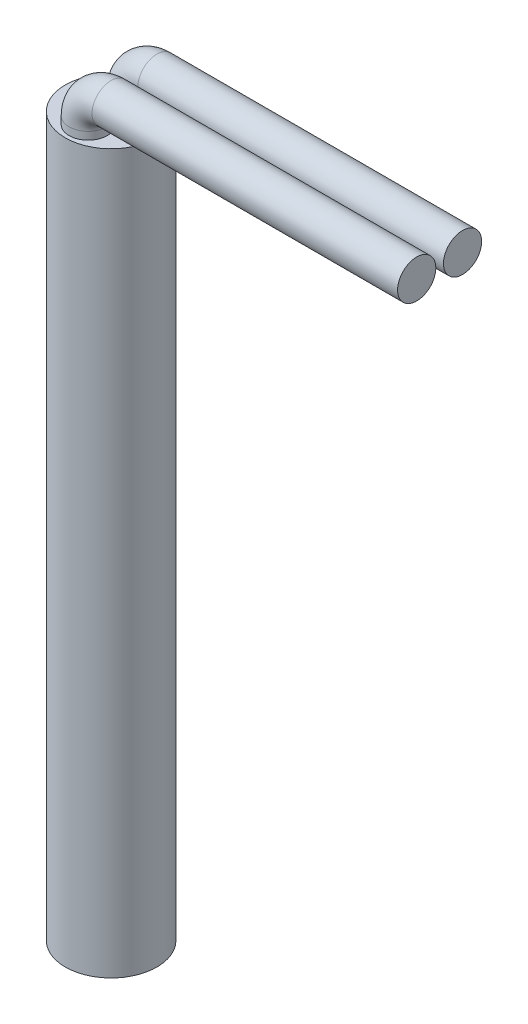
ISO-10303-21;
HEADER;
FILE_DESCRIPTION(('STEP AP214'),'2;1');
FILE_NAME('part.step','',(''),(''),'','','');
FILE_SCHEMA(('AUTOMOTIVE_DESIGN { 1 0 10303 214 1 1 1 1 }'));
ENDSEC;
DATA;
#1=APPLICATION_CONTEXT('core data for automotive mechanical design processes');
#2=APPLICATION_PROTOCOL_DEFINITION('international standard','automotive_design',2000,#1);
#3=PRODUCT_CONTEXT('',#1,'mechanical');
#4=PRODUCT('Part','Part','',(#3));
#5=PRODUCT_RELATED_PRODUCT_CATEGORY('part','',(#4));
#6=PRODUCT_DEFINITION_FORMATION('','',#4);
#7=PRODUCT_DEFINITION_CONTEXT('part definition',#1,'design');
#8=PRODUCT_DEFINITION('design','',#6,#7);
#9=PRODUCT_DEFINITION_SHAPE('','',#8);
#10=(LENGTH_UNIT() NAMED_UNIT(*) SI_UNIT(.MILLI.,.METRE.));
#11=(NAMED_UNIT(*) PLANE_ANGLE_UNIT() SI_UNIT($,.RADIAN.));
#12=(NAMED_UNIT(*) SI_UNIT($,.STERADIAN.) SOLID_ANGLE_UNIT());
#13=UNCERTAINTY_MEASURE_WITH_UNIT(LENGTH_MEASURE(1.E-05),#10,'distance_accuracy_value','');
#14=(GEOMETRIC_REPRESENTATION_CONTEXT(3) GLOBAL_UNCERTAINTY_ASSIGNED_CONTEXT((#13)) GLOBAL_UNIT_ASSIGNED_CONTEXT((#10,
#11,#12)) REPRESENTATION_CONTEXT('',''));
#15=CARTESIAN_POINT('',(0.,0.,0.));
#16=DIRECTION('',(0.,0.,1.));
#17=DIRECTION('',(1.,0.,0.));
#18=AXIS2_PLACEMENT_3D('',#15,#16,#17);
#19=CARTESIAN_POINT('',(0.,47.,0.));
#20=DIRECTION('',(0.,-1.,0.));
#21=DIRECTION('',(0.,0.,-1.));
#22=AXIS2_PLACEMENT_3D('',#19,#20,#21);
#23=CYLINDRICAL_SURFACE('',#22,3.);
#24=CARTESIAN_POINT('',(0.,47.,0.));
#25=DIRECTION('',(0.,1.,0.));
#26=DIRECTION('',(0.,0.,1.));
#27=AXIS2_PLACEMENT_3D('',#24,#25,#26);
#28=CIRCLE('',#27,3.);
#29=CARTESIAN_POINT('',(0.,47.,3.));
#30=VERTEX_POINT('',#29);
#31=EDGE_CURVE('E51',#30,#30,#28,.T.);
#32=ORIENTED_EDGE('',*,*,#31,.F.);
#33=EDGE_LOOP('',(#32));
#34=FACE_BOUND('',#33,.T.);
#35=CARTESIAN_POINT('',(0.,0.,0.));
#36=DIRECTION('',(0.,1.,0.));
#37=DIRECTION('',(0.,0.,1.));
#38=AXIS2_PLACEMENT_3D('',#35,#36,#37);
#39=CIRCLE('',#38,3.);
#40=CARTESIAN_POINT('',(0.,0.,3.));
#41=VERTEX_POINT('',#40);
#42=EDGE_CURVE('E56',#41,#41,#39,.T.);
#43=ORIENTED_EDGE('',*,*,#42,.T.);
#44=EDGE_LOOP('',(#43));
#45=FACE_BOUND('',#44,.T.);
#46=ADVANCED_FACE('F41',(#34,#45),#23,.T.);
#47=CARTESIAN_POINT('',(0.,47.,0.));
#48=DIRECTION('',(0.,1.,0.));
#49=DIRECTION('',(0.,0.,1.));
#50=AXIS2_PLACEMENT_3D('',#47,#48,#49);
#51=PLANE('',#50);
#52=CARTESIAN_POINT('',(0.,47.,-1.5));
#53=DIRECTION('',(0.,1.,0.));
#54=DIRECTION('',(0.,0.,1.));
#55=AXIS2_PLACEMENT_3D('',#52,#53,#54);
#56=CIRCLE('',#55,1.25);
#57=CARTESIAN_POINT('',(0.,47.,-0.25));
#58=VERTEX_POINT('',#57);
#59=EDGE_CURVE('E10',#58,#58,#56,.T.);
#60=ORIENTED_EDGE('',*,*,#59,.F.);
#61=EDGE_LOOP('',(#60));
#62=FACE_BOUND('',#61,.T.);
#63=CARTESIAN_POINT('',(0.,47.,1.5));
#64=DIRECTION('',(0.,1.,0.));
#65=DIRECTION('',(0.,0.,1.));
#66=AXIS2_PLACEMENT_3D('',#63,#64,#65);
#67=CIRCLE('',#66,1.25);
#68=CARTESIAN_POINT('',(0.,47.,2.75));
#69=VERTEX_POINT('',#68);
#70=EDGE_CURVE('E47',#69,#69,#67,.T.);
#71=ORIENTED_EDGE('',*,*,#70,.F.);
#72=EDGE_LOOP('',(#71));
#73=FACE_BOUND('',#72,.T.);
#74=ORIENTED_EDGE('',*,*,#31,.T.);
#75=EDGE_LOOP('',(#74));
#76=FACE_BOUND('',#75,.T.);
#77=ADVANCED_FACE('F77',(#62,#73,#76),#51,.T.);
#78=CARTESIAN_POINT('',(0.,0.,0.));
#79=DIRECTION('',(0.,1.,0.));
#80=DIRECTION('',(0.,0.,1.));
#81=AXIS2_PLACEMENT_3D('',#78,#79,#80);
#82=PLANE('',#81);
#83=ORIENTED_EDGE('',*,*,#42,.F.);
#84=EDGE_LOOP('',(#83));
#85=FACE_BOUND('',#84,.T.);
#86=ADVANCED_FACE('F74',(#85),#82,.F.);
#87=CARTESIAN_POINT('',(21.5,49.,1.5));
#88=DIRECTION('',(1.,0.,0.));
#89=DIRECTION('',(0.,0.,1.));
#90=AXIS2_PLACEMENT_3D('',#87,#88,#89);
#91=PLANE('',#90);
#92=CARTESIAN_POINT('',(21.5,49.,1.5));
#93=DIRECTION('',(1.,0.,0.));
#94=DIRECTION('',(0.,0.,1.));
#95=AXIS2_PLACEMENT_3D('',#92,#93,#94);
#96=CIRCLE('',#95,1.25);
#97=CARTESIAN_POINT('',(21.5,49.,2.75));
#98=VERTEX_POINT('',#97);
#99=EDGE_CURVE('E68',#98,#98,#96,.T.);
#100=ORIENTED_EDGE('',*,*,#99,.T.);
#101=EDGE_LOOP('',(#100));
#102=FACE_BOUND('',#101,.T.);
#103=ADVANCED_FACE('F76',(#102),#91,.T.);
#104=CARTESIAN_POINT('',(0.,47.,1.5));
#105=DIRECTION('',(0.,1.,0.));
#106=DIRECTION('',(-1.,0.,0.));
#107=AXIS2_PLACEMENT_3D('',#104,#105,#106);
#108=CYLINDRICAL_SURFACE('',#107,1.25);
#109=CARTESIAN_POINT('',(0.,47.5,1.5));
#110=DIRECTION('',(0.,1.,0.));
#111=DIRECTION('',(0.,0.,1.));
#112=AXIS2_PLACEMENT_3D('',#109,#110,#111);
#113=CIRCLE('',#112,1.25);
#114=CARTESIAN_POINT('',(-1.25000000000008,47.5,1.5));
#115=VERTEX_POINT('',#114);
#116=EDGE_CURVE('E62',#115,#115,#113,.T.);
#117=ORIENTED_EDGE('',*,*,#116,.F.);
#118=EDGE_LOOP('',(#117));
#119=FACE_BOUND('',#118,.T.);
#120=ORIENTED_EDGE('',*,*,#70,.T.);
#121=EDGE_LOOP('',(#120));
#122=FACE_BOUND('',#121,.T.);
#123=ADVANCED_FACE('F83',(#119,#122),#108,.T.);
#124=CARTESIAN_POINT('',(1.5,47.5,1.5));
#125=DIRECTION('',(0.,0.,-1.));
#126=DIRECTION('',(-1.,0.,0.));
#127=AXIS2_PLACEMENT_3D('',#124,#125,#126);
#128=TOROIDAL_SURFACE('',#127,1.50000000000008,1.25);
#129=CARTESIAN_POINT('',(1.5,49.,1.5));
#130=DIRECTION('',(1.,0.,0.));
#131=DIRECTION('',(0.,0.,1.));
#132=AXIS2_PLACEMENT_3D('',#129,#130,#131);
#133=CIRCLE('',#132,1.25);
#134=CARTESIAN_POINT('',(1.5,50.2500000000001,1.5));
#135=VERTEX_POINT('',#134);
#136=EDGE_CURVE('E65',#135,#135,#133,.T.);
#137=CARTESIAN_POINT('',(1.5,47.5,1.5));
#138=DIRECTION('',(0.,0.,-1.));
#139=DIRECTION('',(-1.,0.,0.));
#140=AXIS2_PLACEMENT_3D('',#137,#138,#139);
#141=CIRCLE('',#140,2.75000000000008);
#142=EDGE_CURVE('',#115,#135,#141,.T.);
#143=ORIENTED_EDGE('',*,*,#116,.T.);
#144=ORIENTED_EDGE('',*,*,#136,.F.);
#145=ORIENTED_EDGE('',*,*,#142,.T.);
#146=ORIENTED_EDGE('',*,*,#142,.F.);
#147=EDGE_LOOP('',(#143,#145,#144,#146));
#148=FACE_BOUND('',#147,.T.);
#149=ADVANCED_FACE('F91',(#148),#128,.T.);
#150=CARTESIAN_POINT('',(1.5,49.,1.5));
#151=DIRECTION('',(1.,0.,0.));
#152=DIRECTION('',(0.,0.,-1.));
#153=AXIS2_PLACEMENT_3D('',#150,#151,#152);
#154=CYLINDRICAL_SURFACE('',#153,1.25);
#155=ORIENTED_EDGE('',*,*,#99,.F.);
#156=EDGE_LOOP('',(#155));
#157=FACE_BOUND('',#156,.T.);
#158=ORIENTED_EDGE('',*,*,#136,.T.);
#159=EDGE_LOOP('',(#158));
#160=FACE_BOUND('',#159,.T.);
#161=ADVANCED_FACE('F78',(#157,#160),#154,.T.);
#162=CARTESIAN_POINT('',(21.5,49.,-1.5));
#163=DIRECTION('',(1.,0.,0.));
#164=DIRECTION('',(0.,0.,-1.));
#165=AXIS2_PLACEMENT_3D('',#162,#163,#164);
#166=PLANE('',#165);
#167=CARTESIAN_POINT('',(21.5,49.,-1.5));
#168=DIRECTION('',(-1.,0.,0.));
#169=DIRECTION('',(0.,0.,-1.));
#170=AXIS2_PLACEMENT_3D('',#167,#168,#169);
#171=CIRCLE('',#170,1.25);
#172=CARTESIAN_POINT('',(21.5,49.,-2.75));
#173=VERTEX_POINT('',#172);
#174=EDGE_CURVE('E60',#173,#173,#171,.F.);
#175=ORIENTED_EDGE('',*,*,#174,.T.);
#176=EDGE_LOOP('',(#175));
#177=FACE_BOUND('',#176,.T.);
#178=ADVANCED_FACE('F90',(#177),#166,.T.);
#179=CARTESIAN_POINT('',(0.,47.,-1.5));
#180=DIRECTION('',(0.,1.,0.));
#181=DIRECTION('',(-1.,0.,0.));
#182=AXIS2_PLACEMENT_3D('',#179,#180,#181);
#183=CYLINDRICAL_SURFACE('',#182,1.25);
#184=CARTESIAN_POINT('',(0.,47.5,-1.5));
#185=DIRECTION('',(0.,-1.,0.));
#186=DIRECTION('',(0.,0.,-1.));
#187=AXIS2_PLACEMENT_3D('',#184,#185,#186);
#188=CIRCLE('',#187,1.25);
#189=CARTESIAN_POINT('',(-1.25000000000008,47.5,-1.5));
#190=VERTEX_POINT('',#189);
#191=EDGE_CURVE('E214',#190,#190,#188,.F.);
#192=ORIENTED_EDGE('',*,*,#191,.F.);
#193=EDGE_LOOP('',(#192));
#194=FACE_BOUND('',#193,.T.);
#195=ORIENTED_EDGE('',*,*,#59,.T.);
#196=EDGE_LOOP('',(#195));
#197=FACE_BOUND('',#196,.T.);
#198=ADVANCED_FACE('F119',(#194,#197),#183,.T.);
#199=CARTESIAN_POINT('',(1.5,47.5,-1.5));
#200=DIRECTION('',(0.,0.,-1.));
#201=DIRECTION('',(-1.,0.,0.));
#202=AXIS2_PLACEMENT_3D('',#199,#200,#201);
#203=TOROIDAL_SURFACE('',#202,1.50000000000008,1.25);
#204=CARTESIAN_POINT('',(1.5,49.,-1.5));
#205=DIRECTION('',(-1.,0.,0.));
#206=DIRECTION('',(0.,0.,-1.));
#207=AXIS2_PLACEMENT_3D('',#204,#205,#206);
#208=CIRCLE('',#207,1.25);
#209=CARTESIAN_POINT('',(1.5,50.2500000000001,-1.5));
#210=VERTEX_POINT('',#209);
#211=EDGE_CURVE('E213',#210,#210,#208,.F.);
#212=CARTESIAN_POINT('',(1.5,47.5,-1.5));
#213=DIRECTION('',(0.,0.,-1.));
#214=DIRECTION('',(-1.,0.,0.));
#215=AXIS2_PLACEMENT_3D('',#212,#213,#214);
#216=CIRCLE('',#215,2.75000000000008);
#217=EDGE_CURVE('',#190,#210,#216,.T.);
#218=ORIENTED_EDGE('',*,*,#191,.T.);
#219=ORIENTED_EDGE('',*,*,#211,.F.);
#220=ORIENTED_EDGE('',*,*,#217,.T.);
#221=ORIENTED_EDGE('',*,*,#217,.F.);
#222=EDGE_LOOP('',(#218,#220,#219,#221));
#223=FACE_BOUND('',#222,.T.);
#224=ADVANCED_FACE('F130',(#223),#203,.T.);
#225=CARTESIAN_POINT('',(1.5,49.,-1.5));
#226=DIRECTION('',(1.,0.,0.));
#227=DIRECTION('',(0.,0.,-1.));
#228=AXIS2_PLACEMENT_3D('',#225,#226,#227);
#229=CYLINDRICAL_SURFACE('',#228,1.25);
#230=ORIENTED_EDGE('',*,*,#174,.F.);
#231=EDGE_LOOP('',(#230));
#232=FACE_BOUND('',#231,.T.);
#233=ORIENTED_EDGE('',*,*,#211,.T.);
#234=EDGE_LOOP('',(#233));
#235=FACE_BOUND('',#234,.T.);
#236=ADVANCED_FACE('F86',(#232,#235),#229,.T.);
#237=CLOSED_SHELL('',(#46,#77,#86,#103,#123,#149,#161,#178,#198,#224,#236));
#238=MANIFOLD_SOLID_BREP('B2',#237);
#239=ADVANCED_BREP_SHAPE_REPRESENTATION('',(#18,#238),#14);
#240=SHAPE_DEFINITION_REPRESENTATION(#9,#239);
ENDSEC;
END-ISO-10303-21;
